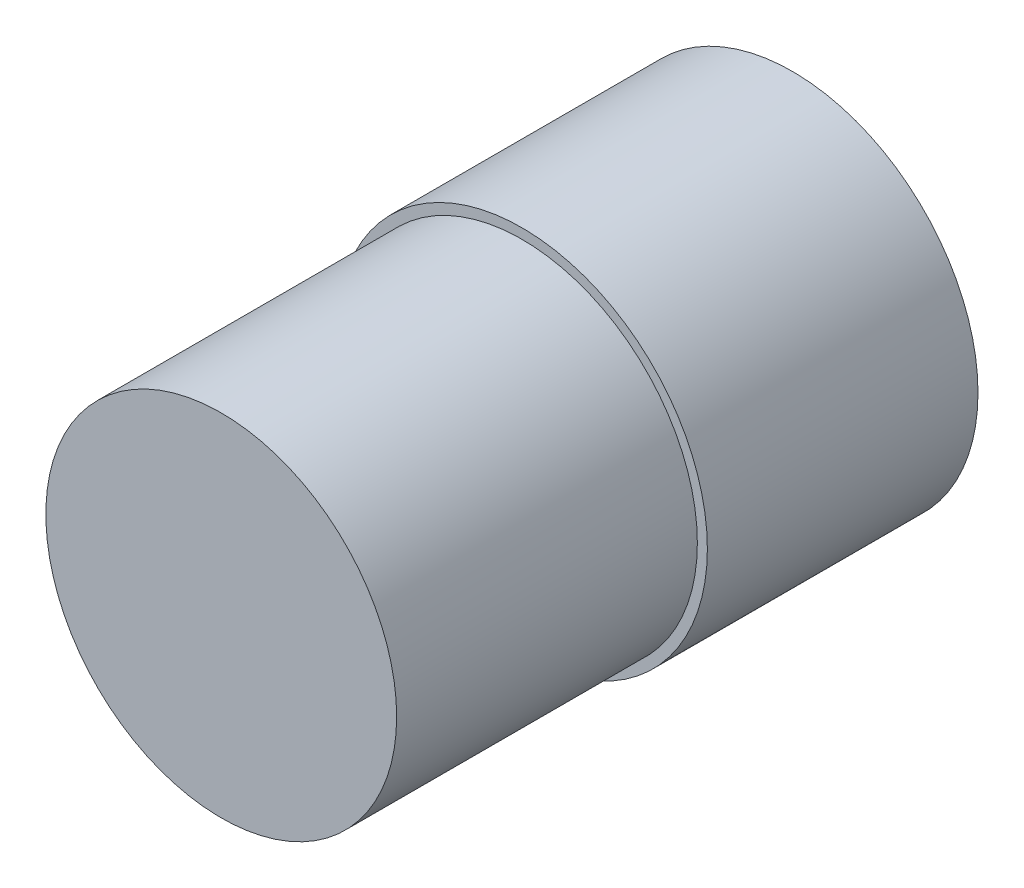
ISO-10303-21;
HEADER;
FILE_DESCRIPTION(('STEP AP214'),'2;1');
FILE_NAME('part.step','',(''),(''),'','','');
FILE_SCHEMA(('AUTOMOTIVE_DESIGN { 1 0 10303 214 1 1 1 1 }'));
ENDSEC;
DATA;
#1=APPLICATION_CONTEXT('core data for automotive mechanical design processes');
#2=APPLICATION_PROTOCOL_DEFINITION('international standard','automotive_design',2000,#1);
#3=PRODUCT_CONTEXT('',#1,'mechanical');
#4=PRODUCT('Part','Part','',(#3));
#5=PRODUCT_RELATED_PRODUCT_CATEGORY('part','',(#4));
#6=PRODUCT_DEFINITION_FORMATION('','',#4);
#7=PRODUCT_DEFINITION_CONTEXT('part definition',#1,'design');
#8=PRODUCT_DEFINITION('design','',#6,#7);
#9=PRODUCT_DEFINITION_SHAPE('','',#8);
#10=(LENGTH_UNIT() NAMED_UNIT(*) SI_UNIT(.MILLI.,.METRE.));
#11=(NAMED_UNIT(*) PLANE_ANGLE_UNIT() SI_UNIT($,.RADIAN.));
#12=(NAMED_UNIT(*) SI_UNIT($,.STERADIAN.) SOLID_ANGLE_UNIT());
#13=UNCERTAINTY_MEASURE_WITH_UNIT(LENGTH_MEASURE(1.E-05),#10,'distance_accuracy_value','');
#14=(GEOMETRIC_REPRESENTATION_CONTEXT(3) GLOBAL_UNCERTAINTY_ASSIGNED_CONTEXT((#13)) GLOBAL_UNIT_ASSIGNED_CONTEXT((#10,
#11,#12)) REPRESENTATION_CONTEXT('',''));
#15=CARTESIAN_POINT('',(0.,0.,0.));
#16=DIRECTION('',(0.,0.,1.));
#17=DIRECTION('',(1.,0.,0.));
#18=AXIS2_PLACEMENT_3D('',#15,#16,#17);
#19=CARTESIAN_POINT('',(0.,0.,27.));
#20=DIRECTION('',(0.,0.,1.));
#21=DIRECTION('',(1.,0.,0.));
#22=AXIS2_PLACEMENT_3D('',#19,#20,#21);
#23=PLANE('',#22);
#24=CARTESIAN_POINT('',(0.,0.,27.));
#25=DIRECTION('',(0.,0.,1.));
#26=DIRECTION('',(1.,0.,0.));
#27=AXIS2_PLACEMENT_3D('',#24,#25,#26);
#28=CIRCLE('',#27,18.5);
#29=CARTESIAN_POINT('',(18.5,0.,27.));
#30=VERTEX_POINT('',#29);
#31=EDGE_CURVE('E10',#30,#30,#28,.T.);
#32=ORIENTED_EDGE('',*,*,#31,.T.);
#33=EDGE_LOOP('',(#32));
#34=FACE_BOUND('',#33,.T.);
#35=CARTESIAN_POINT('',(0.,0.,27.));
#36=DIRECTION('',(0.,0.,1.));
#37=DIRECTION('',(1.,0.,0.));
#38=AXIS2_PLACEMENT_3D('',#35,#36,#37);
#39=CIRCLE('',#38,17.5);
#40=CARTESIAN_POINT('',(17.5,0.,27.));
#41=VERTEX_POINT('',#40);
#42=EDGE_CURVE('E45',#41,#41,#39,.T.);
#43=ORIENTED_EDGE('',*,*,#42,.F.);
#44=EDGE_LOOP('',(#43));
#45=FACE_BOUND('',#44,.T.);
#46=ADVANCED_FACE('F32',(#34,#45),#23,.T.);
#47=CARTESIAN_POINT('',(0.,0.,27.));
#48=DIRECTION('',(0.,0.,-1.));
#49=DIRECTION('',(-1.,0.,0.));
#50=AXIS2_PLACEMENT_3D('',#47,#48,#49);
#51=CYLINDRICAL_SURFACE('',#50,18.5);
#52=ORIENTED_EDGE('',*,*,#31,.F.);
#53=EDGE_LOOP('',(#52));
#54=FACE_BOUND('',#53,.T.);
#55=CARTESIAN_POINT('',(0.,0.,0.));
#56=DIRECTION('',(0.,0.,1.));
#57=DIRECTION('',(1.,0.,0.));
#58=AXIS2_PLACEMENT_3D('',#55,#56,#57);
#59=CIRCLE('',#58,18.5);
#60=CARTESIAN_POINT('',(18.5,0.,0.));
#61=VERTEX_POINT('',#60);
#62=EDGE_CURVE('E36',#61,#61,#59,.T.);
#63=ORIENTED_EDGE('',*,*,#62,.T.);
#64=EDGE_LOOP('',(#63));
#65=FACE_BOUND('',#64,.T.);
#66=ADVANCED_FACE('F34',(#54,#65),#51,.T.);
#67=CARTESIAN_POINT('',(0.,0.,0.));
#68=DIRECTION('',(0.,0.,1.));
#69=DIRECTION('',(1.,0.,0.));
#70=AXIS2_PLACEMENT_3D('',#67,#68,#69);
#71=PLANE('',#70);
#72=CARTESIAN_POINT('',(-8.,11.75,0.));
#73=DIRECTION('',(0.,0.,-1.));
#74=DIRECTION('',(1.,0.,0.));
#75=AXIS2_PLACEMENT_3D('',#72,#73,#74);
#76=CIRCLE('',#75,1.6);
#77=CARTESIAN_POINT('',(-6.4,11.75,0.));
#78=VERTEX_POINT('',#77);
#79=EDGE_CURVE('E75',#78,#78,#76,.T.);
#80=ORIENTED_EDGE('',*,*,#79,.F.);
#81=EDGE_LOOP('',(#80));
#82=FACE_BOUND('',#81,.T.);
#83=CARTESIAN_POINT('',(-16.,-1.25,0.));
#84=DIRECTION('',(0.,0.,-1.));
#85=DIRECTION('',(1.,0.,0.));
#86=AXIS2_PLACEMENT_3D('',#83,#84,#85);
#87=CIRCLE('',#86,1.6);
#88=CARTESIAN_POINT('',(-14.4,-1.25,0.));
#89=VERTEX_POINT('',#88);
#90=EDGE_CURVE('E69',#89,#89,#87,.T.);
#91=ORIENTED_EDGE('',*,*,#90,.F.);
#92=EDGE_LOOP('',(#91));
#93=FACE_BOUND('',#92,.T.);
#94=CARTESIAN_POINT('',(8.,11.75,0.));
#95=DIRECTION('',(0.,0.,-1.));
#96=DIRECTION('',(-1.,0.,0.));
#97=AXIS2_PLACEMENT_3D('',#94,#95,#96);
#98=CIRCLE('',#97,1.6);
#99=CARTESIAN_POINT('',(6.4,11.75,0.));
#100=VERTEX_POINT('',#99);
#101=EDGE_CURVE('E63',#100,#100,#98,.T.);
#102=ORIENTED_EDGE('',*,*,#101,.F.);
#103=EDGE_LOOP('',(#102));
#104=FACE_BOUND('',#103,.T.);
#105=CARTESIAN_POINT('',(16.,-1.25,0.));
#106=DIRECTION('',(0.,0.,-1.));
#107=DIRECTION('',(-1.,0.,0.));
#108=AXIS2_PLACEMENT_3D('',#105,#106,#107);
#109=CIRCLE('',#108,1.6);
#110=CARTESIAN_POINT('',(14.4,-1.25,0.));
#111=VERTEX_POINT('',#110);
#112=EDGE_CURVE('E57',#111,#111,#109,.T.);
#113=ORIENTED_EDGE('',*,*,#112,.F.);
#114=EDGE_LOOP('',(#113));
#115=FACE_BOUND('',#114,.T.);
#116=CARTESIAN_POINT('',(0.,-9.25,0.));
#117=DIRECTION('',(0.,0.,-1.));
#118=DIRECTION('',(-1.,0.,0.));
#119=AXIS2_PLACEMENT_3D('',#116,#117,#118);
#120=CIRCLE('',#119,2.75);
#121=CARTESIAN_POINT('',(-2.75,-9.25,0.));
#122=VERTEX_POINT('',#121);
#123=EDGE_CURVE('E51',#122,#122,#120,.T.);
#124=ORIENTED_EDGE('',*,*,#123,.F.);
#125=EDGE_LOOP('',(#124));
#126=FACE_BOUND('',#125,.T.);
#127=ORIENTED_EDGE('',*,*,#62,.F.);
#128=EDGE_LOOP('',(#127));
#129=FACE_BOUND('',#128,.T.);
#130=ADVANCED_FACE('F90',(#82,#93,#104,#115,#126,#129),#71,.F.);
#131=CARTESIAN_POINT('',(0.,0.,57.));
#132=DIRECTION('',(0.,0.,-1.));
#133=DIRECTION('',(-1.,0.,0.));
#134=AXIS2_PLACEMENT_3D('',#131,#132,#133);
#135=CYLINDRICAL_SURFACE('',#134,17.5);
#136=CARTESIAN_POINT('',(0.,0.,57.));
#137=DIRECTION('',(0.,0.,1.));
#138=DIRECTION('',(1.,0.,0.));
#139=AXIS2_PLACEMENT_3D('',#136,#137,#138);
#140=CIRCLE('',#139,17.5);
#141=CARTESIAN_POINT('',(17.5,0.,57.));
#142=VERTEX_POINT('',#141);
#143=EDGE_CURVE('E43',#142,#142,#140,.T.);
#144=ORIENTED_EDGE('',*,*,#143,.F.);
#145=EDGE_LOOP('',(#144));
#146=FACE_BOUND('',#145,.T.);
#147=ORIENTED_EDGE('',*,*,#42,.T.);
#148=EDGE_LOOP('',(#147));
#149=FACE_BOUND('',#148,.T.);
#150=ADVANCED_FACE('F93',(#146,#149),#135,.T.);
#151=CARTESIAN_POINT('',(0.,0.,57.));
#152=DIRECTION('',(0.,0.,1.));
#153=DIRECTION('',(1.,0.,0.));
#154=AXIS2_PLACEMENT_3D('',#151,#152,#153);
#155=PLANE('',#154);
#156=ORIENTED_EDGE('',*,*,#143,.T.);
#157=EDGE_LOOP('',(#156));
#158=FACE_BOUND('',#157,.T.);
#159=ADVANCED_FACE('F116',(#158),#155,.T.);
#160=CARTESIAN_POINT('',(0.,-9.25,24.4));
#161=DIRECTION('',(0.,0.,-1.));
#162=DIRECTION('',(-1.,0.,0.));
#163=AXIS2_PLACEMENT_3D('',#160,#161,#162);
#164=CYLINDRICAL_SURFACE('',#163,2.75);
#165=ORIENTED_EDGE('',*,*,#123,.T.);
#166=EDGE_LOOP('',(#165));
#167=FACE_BOUND('',#166,.T.);
#168=CARTESIAN_POINT('',(0.,-9.25,24.4));
#169=DIRECTION('',(0.,0.,-1.));
#170=DIRECTION('',(-1.,0.,0.));
#171=AXIS2_PLACEMENT_3D('',#168,#169,#170);
#172=CIRCLE('',#171,2.75);
#173=CARTESIAN_POINT('',(-2.75,-9.25,24.4));
#174=VERTEX_POINT('',#173);
#175=EDGE_CURVE('E48',#174,#174,#172,.T.);
#176=ORIENTED_EDGE('',*,*,#175,.F.);
#177=EDGE_LOOP('',(#176));
#178=FACE_BOUND('',#177,.T.);
#179=ADVANCED_FACE('F120',(#167,#178),#164,.F.);
#180=CARTESIAN_POINT('',(0.,-9.25,24.4));
#181=DIRECTION('',(0.,0.,-1.));
#182=DIRECTION('',(-1.,0.,0.));
#183=AXIS2_PLACEMENT_3D('',#180,#181,#182);
#184=PLANE('',#183);
#185=ORIENTED_EDGE('',*,*,#175,.T.);
#186=EDGE_LOOP('',(#185));
#187=FACE_BOUND('',#186,.T.);
#188=ADVANCED_FACE('F124',(#187),#184,.T.);
#189=CARTESIAN_POINT('',(16.,-1.25,10.));
#190=DIRECTION('',(0.,0.,-1.));
#191=DIRECTION('',(-1.,0.,0.));
#192=AXIS2_PLACEMENT_3D('',#189,#190,#191);
#193=CYLINDRICAL_SURFACE('',#192,1.6);
#194=CARTESIAN_POINT('',(16.,-1.25,10.));
#195=DIRECTION('',(0.,0.,-1.));
#196=DIRECTION('',(-1.,0.,0.));
#197=AXIS2_PLACEMENT_3D('',#194,#195,#196);
#198=CIRCLE('',#197,1.6);
#199=CARTESIAN_POINT('',(14.4,-1.25,10.));
#200=VERTEX_POINT('',#199);
#201=EDGE_CURVE('E54',#200,#200,#198,.T.);
#202=ORIENTED_EDGE('',*,*,#201,.F.);
#203=EDGE_LOOP('',(#202));
#204=FACE_BOUND('',#203,.T.);
#205=ORIENTED_EDGE('',*,*,#112,.T.);
#206=EDGE_LOOP('',(#205));
#207=FACE_BOUND('',#206,.T.);
#208=ADVANCED_FACE('F128',(#204,#207),#193,.F.);
#209=CARTESIAN_POINT('',(16.,-1.25,10.));
#210=DIRECTION('',(0.,0.,-1.));
#211=DIRECTION('',(-1.,0.,0.));
#212=AXIS2_PLACEMENT_3D('',#209,#210,#211);
#213=PLANE('',#212);
#214=ORIENTED_EDGE('',*,*,#201,.T.);
#215=EDGE_LOOP('',(#214));
#216=FACE_BOUND('',#215,.T.);
#217=ADVANCED_FACE('F132',(#216),#213,.T.);
#218=CARTESIAN_POINT('',(8.,11.75,10.));
#219=DIRECTION('',(0.,0.,-1.));
#220=DIRECTION('',(-1.,0.,0.));
#221=AXIS2_PLACEMENT_3D('',#218,#219,#220);
#222=CYLINDRICAL_SURFACE('',#221,1.6);
#223=CARTESIAN_POINT('',(8.,11.75,10.));
#224=DIRECTION('',(0.,0.,-1.));
#225=DIRECTION('',(-1.,0.,0.));
#226=AXIS2_PLACEMENT_3D('',#223,#224,#225);
#227=CIRCLE('',#226,1.6);
#228=CARTESIAN_POINT('',(6.4,11.75,10.));
#229=VERTEX_POINT('',#228);
#230=EDGE_CURVE('E60',#229,#229,#227,.T.);
#231=ORIENTED_EDGE('',*,*,#230,.F.);
#232=EDGE_LOOP('',(#231));
#233=FACE_BOUND('',#232,.T.);
#234=ORIENTED_EDGE('',*,*,#101,.T.);
#235=EDGE_LOOP('',(#234));
#236=FACE_BOUND('',#235,.T.);
#237=ADVANCED_FACE('F136',(#233,#236),#222,.F.);
#238=CARTESIAN_POINT('',(8.,11.75,10.));
#239=DIRECTION('',(0.,0.,-1.));
#240=DIRECTION('',(-1.,0.,0.));
#241=AXIS2_PLACEMENT_3D('',#238,#239,#240);
#242=PLANE('',#241);
#243=ORIENTED_EDGE('',*,*,#230,.T.);
#244=EDGE_LOOP('',(#243));
#245=FACE_BOUND('',#244,.T.);
#246=ADVANCED_FACE('F140',(#245),#242,.T.);
#247=CARTESIAN_POINT('',(-16.,-1.25,10.));
#248=DIRECTION('',(0.,0.,-1.));
#249=DIRECTION('',(-1.,0.,0.));
#250=AXIS2_PLACEMENT_3D('',#247,#248,#249);
#251=CYLINDRICAL_SURFACE('',#250,1.6);
#252=CARTESIAN_POINT('',(-16.,-1.25,10.));
#253=DIRECTION('',(0.,0.,-1.));
#254=DIRECTION('',(1.,0.,0.));
#255=AXIS2_PLACEMENT_3D('',#252,#253,#254);
#256=CIRCLE('',#255,1.6);
#257=CARTESIAN_POINT('',(-14.4,-1.25,10.));
#258=VERTEX_POINT('',#257);
#259=EDGE_CURVE('E66',#258,#258,#256,.T.);
#260=ORIENTED_EDGE('',*,*,#259,.F.);
#261=EDGE_LOOP('',(#260));
#262=FACE_BOUND('',#261,.T.);
#263=ORIENTED_EDGE('',*,*,#90,.T.);
#264=EDGE_LOOP('',(#263));
#265=FACE_BOUND('',#264,.T.);
#266=ADVANCED_FACE('F144',(#262,#265),#251,.F.);
#267=CARTESIAN_POINT('',(-16.,-1.25,10.));
#268=DIRECTION('',(0.,0.,1.));
#269=DIRECTION('',(1.,0.,0.));
#270=AXIS2_PLACEMENT_3D('',#267,#268,#269);
#271=PLANE('',#270);
#272=ORIENTED_EDGE('',*,*,#259,.T.);
#273=EDGE_LOOP('',(#272));
#274=FACE_BOUND('',#273,.T.);
#275=ADVANCED_FACE('F86',(#274),#271,.F.);
#276=CARTESIAN_POINT('',(-8.,11.75,10.));
#277=DIRECTION('',(0.,0.,-1.));
#278=DIRECTION('',(-1.,0.,0.));
#279=AXIS2_PLACEMENT_3D('',#276,#277,#278);
#280=CYLINDRICAL_SURFACE('',#279,1.6);
#281=CARTESIAN_POINT('',(-8.,11.75,10.));
#282=DIRECTION('',(0.,0.,-1.));
#283=DIRECTION('',(1.,0.,0.));
#284=AXIS2_PLACEMENT_3D('',#281,#282,#283);
#285=CIRCLE('',#284,1.6);
#286=CARTESIAN_POINT('',(-6.4,11.75,10.));
#287=VERTEX_POINT('',#286);
#288=EDGE_CURVE('E72',#287,#287,#285,.T.);
#289=ORIENTED_EDGE('',*,*,#288,.F.);
#290=EDGE_LOOP('',(#289));
#291=FACE_BOUND('',#290,.T.);
#292=ORIENTED_EDGE('',*,*,#79,.T.);
#293=EDGE_LOOP('',(#292));
#294=FACE_BOUND('',#293,.T.);
#295=ADVANCED_FACE('F83',(#291,#294),#280,.F.);
#296=CARTESIAN_POINT('',(-8.,11.75,10.));
#297=DIRECTION('',(0.,0.,1.));
#298=DIRECTION('',(1.,0.,0.));
#299=AXIS2_PLACEMENT_3D('',#296,#297,#298);
#300=PLANE('',#299);
#301=ORIENTED_EDGE('',*,*,#288,.T.);
#302=EDGE_LOOP('',(#301));
#303=FACE_BOUND('',#302,.T.);
#304=ADVANCED_FACE('F81',(#303),#300,.F.);
#305=CLOSED_SHELL('',(#46,#66,#130,#150,#159,#179,#188,#208,#217,#237,#246,#266,#275,#295,#304));
#306=MANIFOLD_SOLID_BREP('B2',#305);
#307=ADVANCED_BREP_SHAPE_REPRESENTATION('',(#18,#306),#14);
#308=SHAPE_DEFINITION_REPRESENTATION(#9,#307);
ENDSEC;
END-ISO-10303-21;
